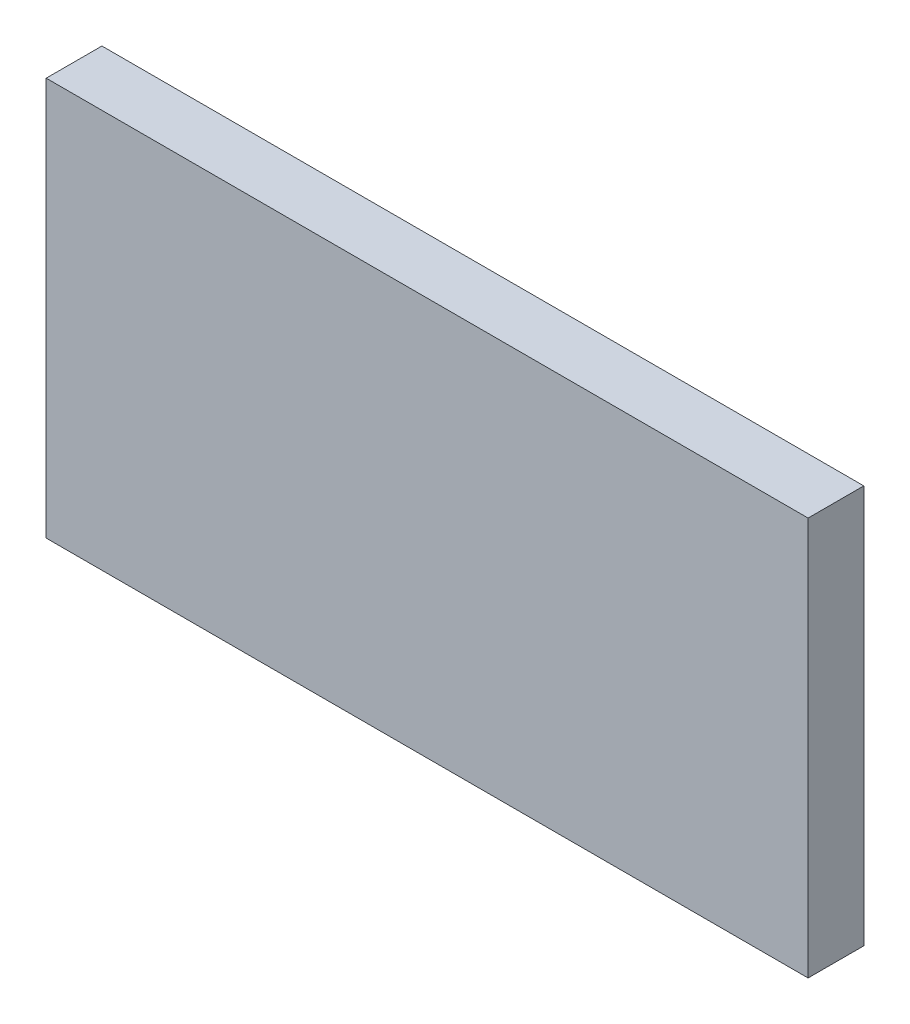
ISO-10303-21;
HEADER;
FILE_DESCRIPTION(('STEP AP214'),'2;1');
FILE_NAME('part.step','',(''),(''),'','','');
FILE_SCHEMA(('AUTOMOTIVE_DESIGN { 1 0 10303 214 1 1 1 1 }'));
ENDSEC;
DATA;
#1=APPLICATION_CONTEXT('core data for automotive mechanical design processes');
#2=APPLICATION_PROTOCOL_DEFINITION('international standard','automotive_design',2000,#1);
#3=PRODUCT_CONTEXT('',#1,'mechanical');
#4=PRODUCT('Part','Part','',(#3));
#5=PRODUCT_RELATED_PRODUCT_CATEGORY('part','',(#4));
#6=PRODUCT_DEFINITION_FORMATION('','',#4);
#7=PRODUCT_DEFINITION_CONTEXT('part definition',#1,'design');
#8=PRODUCT_DEFINITION('design','',#6,#7);
#9=PRODUCT_DEFINITION_SHAPE('','',#8);
#10=(LENGTH_UNIT() NAMED_UNIT(*) SI_UNIT(.MILLI.,.METRE.));
#11=(NAMED_UNIT(*) PLANE_ANGLE_UNIT() SI_UNIT($,.RADIAN.));
#12=(NAMED_UNIT(*) SI_UNIT($,.STERADIAN.) SOLID_ANGLE_UNIT());
#13=UNCERTAINTY_MEASURE_WITH_UNIT(LENGTH_MEASURE(1.E-05),#10,'distance_accuracy_value','');
#14=(GEOMETRIC_REPRESENTATION_CONTEXT(3) GLOBAL_UNCERTAINTY_ASSIGNED_CONTEXT((#13)) GLOBAL_UNIT_ASSIGNED_CONTEXT((#10,
#11,#12)) REPRESENTATION_CONTEXT('',''));
#15=CARTESIAN_POINT('',(0.,0.,0.));
#16=DIRECTION('',(0.,0.,1.));
#17=DIRECTION('',(1.,0.,0.));
#18=AXIS2_PLACEMENT_3D('',#15,#16,#17);
#19=CARTESIAN_POINT('',(-66.9664957398352,38.5908619517695,5.));
#20=DIRECTION('',(1.,0.,0.));
#21=DIRECTION('',(0.,0.,-1.));
#22=AXIS2_PLACEMENT_3D('',#19,#20,#21);
#23=PLANE('',#22);
#24=DIRECTION('',(0.,-1.,0.));
#25=VECTOR('',#24,1.);
#26=CARTESIAN_POINT('',(-66.9664957398352,38.5908619517695,-5.));
#27=LINE('',#26,#25);
#28=CARTESIAN_POINT('',(-66.9664957398352,38.5908619517695,-5.));
#29=VERTEX_POINT('',#28);
#30=CARTESIAN_POINT('',(-66.9664957398352,-32.9157351941563,-5.));
#31=VERTEX_POINT('',#30);
#32=EDGE_CURVE('E100',#29,#31,#27,.T.);
#33=ORIENTED_EDGE('',*,*,#32,.T.);
#34=DIRECTION('',(0.,0.,-1.));
#35=VECTOR('',#34,1.);
#36=CARTESIAN_POINT('',(-66.9664957398352,-32.9157351941563,5.));
#37=LINE('',#36,#35);
#38=CARTESIAN_POINT('',(-66.9664957398352,-32.9157351941563,5.));
#39=VERTEX_POINT('',#38);
#40=EDGE_CURVE('E11',#39,#31,#37,.T.);
#41=ORIENTED_EDGE('',*,*,#40,.F.);
#42=DIRECTION('',(0.,-1.,0.));
#43=VECTOR('',#42,1.);
#44=CARTESIAN_POINT('',(-66.9664957398352,38.5908619517695,5.));
#45=LINE('',#44,#43);
#46=CARTESIAN_POINT('',(-66.9664957398352,38.5908619517695,5.));
#47=VERTEX_POINT('',#46);
#48=EDGE_CURVE('E88',#47,#39,#45,.T.);
#49=ORIENTED_EDGE('',*,*,#48,.F.);
#50=DIRECTION('',(0.,0.,-1.));
#51=VECTOR('',#50,1.);
#52=CARTESIAN_POINT('',(-66.9664957398352,38.5908619517695,5.));
#53=LINE('',#52,#51);
#54=EDGE_CURVE('E96',#47,#29,#53,.T.);
#55=ORIENTED_EDGE('',*,*,#54,.T.);
#56=EDGE_LOOP('',(#33,#41,#49,#55));
#57=FACE_BOUND('',#56,.T.);
#58=ADVANCED_FACE('F37',(#57),#23,.F.);
#59=CARTESIAN_POINT('',(-66.9664957398352,-32.9157351941563,5.));
#60=DIRECTION('',(0.,1.,0.));
#61=DIRECTION('',(0.,0.,1.));
#62=AXIS2_PLACEMENT_3D('',#59,#60,#61);
#63=PLANE('',#62);
#64=DIRECTION('',(1.,0.,0.));
#65=VECTOR('',#64,1.);
#66=CARTESIAN_POINT('',(-66.9664957398352,-32.9157351941563,-5.));
#67=LINE('',#66,#65);
#68=CARTESIAN_POINT('',(69.8040591186418,-32.9157351941563,-5.));
#69=VERTEX_POINT('',#68);
#70=EDGE_CURVE('E92',#31,#69,#67,.T.);
#71=ORIENTED_EDGE('',*,*,#70,.T.);
#72=DIRECTION('',(0.,0.,-1.));
#73=VECTOR('',#72,1.);
#74=CARTESIAN_POINT('',(69.8040591186418,-32.9157351941563,5.));
#75=LINE('',#74,#73);
#76=CARTESIAN_POINT('',(69.8040591186418,-32.9157351941563,5.));
#77=VERTEX_POINT('',#76);
#78=EDGE_CURVE('E45',#77,#69,#75,.T.);
#79=ORIENTED_EDGE('',*,*,#78,.F.);
#80=DIRECTION('',(1.,0.,0.));
#81=VECTOR('',#80,1.);
#82=CARTESIAN_POINT('',(-66.9664957398352,-32.9157351941563,5.));
#83=LINE('',#82,#81);
#84=EDGE_CURVE('E83',#39,#77,#83,.T.);
#85=ORIENTED_EDGE('',*,*,#84,.F.);
#86=ORIENTED_EDGE('',*,*,#40,.T.);
#87=EDGE_LOOP('',(#71,#79,#85,#86));
#88=FACE_BOUND('',#87,.T.);
#89=ADVANCED_FACE('F91',(#88),#63,.F.);
#90=CARTESIAN_POINT('',(69.8040591186418,38.5908619517695,5.));
#91=DIRECTION('',(-1.,0.,0.));
#92=DIRECTION('',(0.,0.,1.));
#93=AXIS2_PLACEMENT_3D('',#90,#91,#92);
#94=PLANE('',#93);
#95=DIRECTION('',(0.,1.,0.));
#96=VECTOR('',#95,1.);
#97=CARTESIAN_POINT('',(69.8040591186418,38.5908619517695,-5.));
#98=LINE('',#97,#96);
#99=CARTESIAN_POINT('',(69.8040591186418,38.5908619517695,-5.));
#100=VERTEX_POINT('',#99);
#101=EDGE_CURVE('E70',#69,#100,#98,.T.);
#102=ORIENTED_EDGE('',*,*,#101,.T.);
#103=DIRECTION('',(0.,0.,-1.));
#104=VECTOR('',#103,1.);
#105=CARTESIAN_POINT('',(69.8040591186418,38.5908619517695,5.));
#106=LINE('',#105,#104);
#107=CARTESIAN_POINT('',(69.8040591186418,38.5908619517695,5.));
#108=VERTEX_POINT('',#107);
#109=EDGE_CURVE('E93',#108,#100,#106,.T.);
#110=ORIENTED_EDGE('',*,*,#109,.F.);
#111=DIRECTION('',(0.,1.,0.));
#112=VECTOR('',#111,1.);
#113=CARTESIAN_POINT('',(69.8040591186418,38.5908619517695,5.));
#114=LINE('',#113,#112);
#115=EDGE_CURVE('E86',#77,#108,#114,.T.);
#116=ORIENTED_EDGE('',*,*,#115,.F.);
#117=ORIENTED_EDGE('',*,*,#78,.T.);
#118=EDGE_LOOP('',(#102,#110,#116,#117));
#119=FACE_BOUND('',#118,.T.);
#120=ADVANCED_FACE('F94',(#119),#94,.F.);
#121=CARTESIAN_POINT('',(-66.9664957398352,38.5908619517695,5.));
#122=DIRECTION('',(0.,-1.,0.));
#123=DIRECTION('',(0.,0.,-1.));
#124=AXIS2_PLACEMENT_3D('',#121,#122,#123);
#125=PLANE('',#124);
#126=DIRECTION('',(-1.,0.,0.));
#127=VECTOR('',#126,1.);
#128=CARTESIAN_POINT('',(-66.9664957398352,38.5908619517695,-5.));
#129=LINE('',#128,#127);
#130=EDGE_CURVE('E76',#100,#29,#129,.T.);
#131=ORIENTED_EDGE('',*,*,#130,.T.);
#132=ORIENTED_EDGE('',*,*,#54,.F.);
#133=DIRECTION('',(-1.,0.,0.));
#134=VECTOR('',#133,1.);
#135=CARTESIAN_POINT('',(-66.9664957398352,38.5908619517695,5.));
#136=LINE('',#135,#134);
#137=EDGE_CURVE('E53',#108,#47,#136,.T.);
#138=ORIENTED_EDGE('',*,*,#137,.F.);
#139=ORIENTED_EDGE('',*,*,#109,.T.);
#140=EDGE_LOOP('',(#131,#132,#138,#139));
#141=FACE_BOUND('',#140,.T.);
#142=ADVANCED_FACE('F107',(#141),#125,.F.);
#143=CARTESIAN_POINT('',(0.,0.,5.));
#144=DIRECTION('',(0.,0.,1.));
#145=DIRECTION('',(1.,0.,0.));
#146=AXIS2_PLACEMENT_3D('',#143,#144,#145);
#147=PLANE('',#146);
#148=ORIENTED_EDGE('',*,*,#48,.T.);
#149=ORIENTED_EDGE('',*,*,#84,.T.);
#150=ORIENTED_EDGE('',*,*,#115,.T.);
#151=ORIENTED_EDGE('',*,*,#137,.T.);
#152=EDGE_LOOP('',(#148,#149,#150,#151));
#153=FACE_BOUND('',#152,.T.);
#154=ADVANCED_FACE('F84',(#153),#147,.T.);
#155=CARTESIAN_POINT('',(0.,0.,-5.));
#156=DIRECTION('',(0.,0.,1.));
#157=DIRECTION('',(1.,0.,0.));
#158=AXIS2_PLACEMENT_3D('',#155,#156,#157);
#159=PLANE('',#158);
#160=ORIENTED_EDGE('',*,*,#32,.F.);
#161=ORIENTED_EDGE('',*,*,#130,.F.);
#162=ORIENTED_EDGE('',*,*,#101,.F.);
#163=ORIENTED_EDGE('',*,*,#70,.F.);
#164=EDGE_LOOP('',(#160,#161,#162,#163));
#165=FACE_BOUND('',#164,.T.);
#166=ADVANCED_FACE('F110',(#165),#159,.F.);
#167=CLOSED_SHELL('',(#58,#89,#120,#142,#154,#166));
#168=MANIFOLD_SOLID_BREP('B2',#167);
#169=ADVANCED_BREP_SHAPE_REPRESENTATION('',(#18,#168),#14);
#170=SHAPE_DEFINITION_REPRESENTATION(#9,#169);
ENDSEC;
END-ISO-10303-21;
